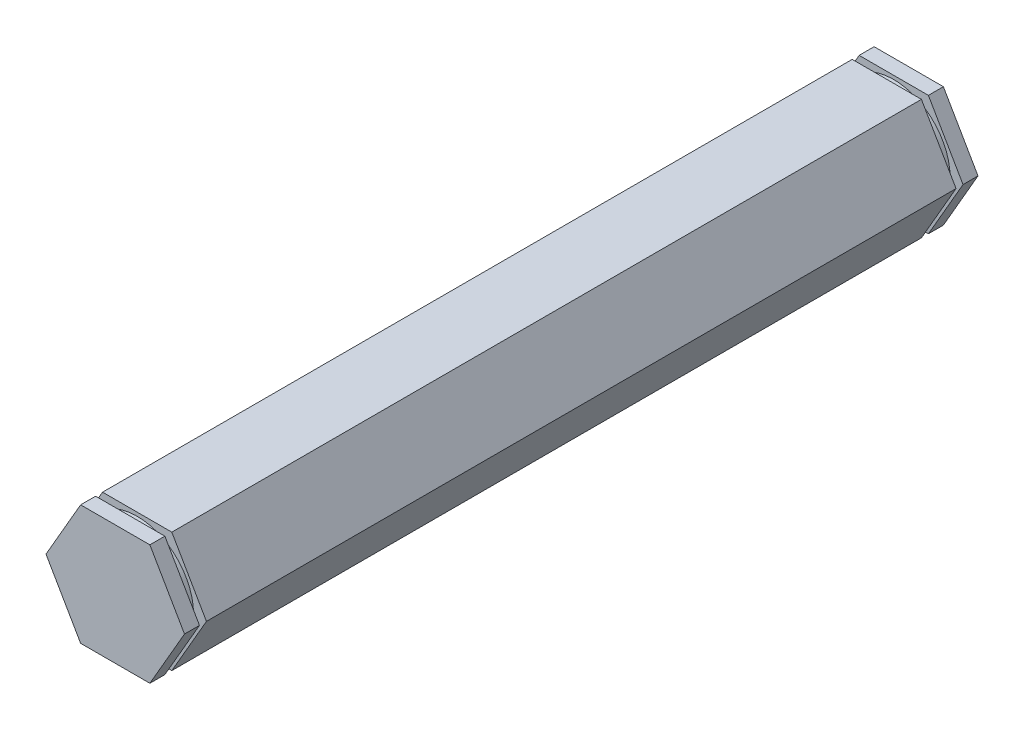
ISO-10303-21;
HEADER;
FILE_DESCRIPTION(('STEP AP214'),'2;1');
FILE_NAME('part.step','',(''),(''),'','','');
FILE_SCHEMA(('AUTOMOTIVE_DESIGN { 1 0 10303 214 1 1 1 1 }'));
ENDSEC;
DATA;
#1=APPLICATION_CONTEXT('core data for automotive mechanical design processes');
#2=APPLICATION_PROTOCOL_DEFINITION('international standard','automotive_design',2000,#1);
#3=PRODUCT_CONTEXT('',#1,'mechanical');
#4=PRODUCT('Part','Part','',(#3));
#5=PRODUCT_RELATED_PRODUCT_CATEGORY('part','',(#4));
#6=PRODUCT_DEFINITION_FORMATION('','',#4);
#7=PRODUCT_DEFINITION_CONTEXT('part definition',#1,'design');
#8=PRODUCT_DEFINITION('design','',#6,#7);
#9=PRODUCT_DEFINITION_SHAPE('','',#8);
#10=(LENGTH_UNIT() NAMED_UNIT(*) SI_UNIT(.MILLI.,.METRE.));
#11=(NAMED_UNIT(*) PLANE_ANGLE_UNIT() SI_UNIT($,.RADIAN.));
#12=(NAMED_UNIT(*) SI_UNIT($,.STERADIAN.) SOLID_ANGLE_UNIT());
#13=UNCERTAINTY_MEASURE_WITH_UNIT(LENGTH_MEASURE(1.E-05),#10,'distance_accuracy_value','');
#14=(GEOMETRIC_REPRESENTATION_CONTEXT(3) GLOBAL_UNCERTAINTY_ASSIGNED_CONTEXT((#13)) GLOBAL_UNIT_ASSIGNED_CONTEXT((#10,
#11,#12)) REPRESENTATION_CONTEXT('',''));
#15=CARTESIAN_POINT('',(0.,0.,0.));
#16=DIRECTION('',(0.,0.,1.));
#17=DIRECTION('',(1.,0.,0.));
#18=AXIS2_PLACEMENT_3D('',#15,#16,#17);
#19=CARTESIAN_POINT('',(3.66617420935418,-6.34999999999993,-52.2732));
#20=DIRECTION('',(0.866025403784441,-0.499999999999995,0.));
#21=DIRECTION('',(0.499999999999995,0.866025403784442,0.));
#22=AXIS2_PLACEMENT_3D('',#19,#20,#21);
#23=PLANE('',#22);
#24=DIRECTION('',(0.5,0.866025403784439,0.));
#25=VECTOR('',#24,1.);
#26=CARTESIAN_POINT('',(5.49926131403119,-3.175,-49.9491));
#27=LINE('',#26,#25);
#28=CARTESIAN_POINT('',(3.66617420935412,-6.35,-49.9491));
#29=VERTEX_POINT('',#28);
#30=CARTESIAN_POINT('',(7.33234841870825,0.,-49.9491));
#31=VERTEX_POINT('',#30);
#32=EDGE_CURVE('E244',#29,#31,#27,.T.);
#33=ORIENTED_EDGE('',*,*,#32,.T.);
#34=DIRECTION('',(0.,0.,1.));
#35=VECTOR('',#34,1.);
#36=CARTESIAN_POINT('',(7.33234841870822,0.,-52.2732));
#37=LINE('',#36,#35);
#38=CARTESIAN_POINT('',(7.33234841870822,0.,29.4259));
#39=VERTEX_POINT('',#38);
#40=EDGE_CURVE('E189',#31,#39,#37,.T.);
#41=ORIENTED_EDGE('',*,*,#40,.T.);
#42=DIRECTION('',(0.5,0.866025403784439,0.));
#43=VECTOR('',#42,1.);
#44=CARTESIAN_POINT('',(5.49926131403119,-3.175,29.4259));
#45=LINE('',#44,#43);
#46=CARTESIAN_POINT('',(3.66617420935412,-6.35,29.4259));
#47=VERTEX_POINT('',#46);
#48=EDGE_CURVE('E243',#47,#39,#45,.T.);
#49=ORIENTED_EDGE('',*,*,#48,.F.);
#50=DIRECTION('',(0.,0.,1.));
#51=VECTOR('',#50,1.);
#52=CARTESIAN_POINT('',(3.66617420935418,-6.34999999999993,-52.2732));
#53=LINE('',#52,#51);
#54=EDGE_CURVE('E46',#29,#47,#53,.T.);
#55=ORIENTED_EDGE('',*,*,#54,.F.);
#56=EDGE_LOOP('',(#33,#41,#49,#55));
#57=FACE_BOUND('',#56,.T.);
#58=ADVANCED_FACE('F37',(#57),#23,.T.);
#59=CARTESIAN_POINT('',(-3.66617420935405,-6.35000000000001,-52.2732));
#60=DIRECTION('',(0.,-1.,0.));
#61=DIRECTION('',(1.,0.,0.));
#62=AXIS2_PLACEMENT_3D('',#59,#60,#61);
#63=PLANE('',#62);
#64=DIRECTION('',(1.,0.,0.));
#65=VECTOR('',#64,1.);
#66=CARTESIAN_POINT('',(0.,-6.35,-49.9491));
#67=LINE('',#66,#65);
#68=CARTESIAN_POINT('',(-3.66617420935412,-6.35,-49.9491));
#69=VERTEX_POINT('',#68);
#70=EDGE_CURVE('E316',#69,#29,#67,.T.);
#71=ORIENTED_EDGE('',*,*,#70,.T.);
#72=ORIENTED_EDGE('',*,*,#54,.T.);
#73=DIRECTION('',(1.,0.,0.));
#74=VECTOR('',#73,1.);
#75=CARTESIAN_POINT('',(0.,-6.35,29.4259));
#76=LINE('',#75,#74);
#77=CARTESIAN_POINT('',(-3.66617420935412,-6.35,29.4259));
#78=VERTEX_POINT('',#77);
#79=EDGE_CURVE('E256',#78,#47,#76,.T.);
#80=ORIENTED_EDGE('',*,*,#79,.F.);
#81=DIRECTION('',(0.,0.,1.));
#82=VECTOR('',#81,1.);
#83=CARTESIAN_POINT('',(-3.66617420935405,-6.35000000000001,-52.2732));
#84=LINE('',#83,#82);
#85=EDGE_CURVE('E215',#69,#78,#84,.T.);
#86=ORIENTED_EDGE('',*,*,#85,.F.);
#87=EDGE_LOOP('',(#71,#72,#80,#86));
#88=FACE_BOUND('',#87,.T.);
#89=ADVANCED_FACE('F348',(#88),#63,.T.);
#90=CARTESIAN_POINT('',(-7.33234841870822,0.,-52.2732));
#91=DIRECTION('',(-0.866025403784434,-0.500000000000007,0.));
#92=DIRECTION('',(0.500000000000007,-0.866025403784435,0.));
#93=AXIS2_PLACEMENT_3D('',#90,#91,#92);
#94=PLANE('',#93);
#95=DIRECTION('',(0.5,-0.866025403784439,0.));
#96=VECTOR('',#95,1.);
#97=CARTESIAN_POINT('',(-5.49926131403118,-3.175,-49.9491));
#98=LINE('',#97,#96);
#99=CARTESIAN_POINT('',(-7.33234841870824,0.,-49.9491));
#100=VERTEX_POINT('',#99);
#101=EDGE_CURVE('E326',#100,#69,#98,.T.);
#102=ORIENTED_EDGE('',*,*,#101,.T.);
#103=ORIENTED_EDGE('',*,*,#85,.T.);
#104=DIRECTION('',(0.5,-0.866025403784439,0.));
#105=VECTOR('',#104,1.);
#106=CARTESIAN_POINT('',(-5.49926131403118,-3.175,29.4259));
#107=LINE('',#106,#105);
#108=CARTESIAN_POINT('',(-7.33234841870824,0.,29.4259));
#109=VERTEX_POINT('',#108);
#110=EDGE_CURVE('E198',#109,#78,#107,.T.);
#111=ORIENTED_EDGE('',*,*,#110,.F.);
#112=DIRECTION('',(0.,0.,1.));
#113=VECTOR('',#112,1.);
#114=CARTESIAN_POINT('',(-7.33234841870822,0.,-52.2732));
#115=LINE('',#114,#113);
#116=EDGE_CURVE('E220',#100,#109,#115,.T.);
#117=ORIENTED_EDGE('',*,*,#116,.F.);
#118=EDGE_LOOP('',(#102,#103,#111,#117));
#119=FACE_BOUND('',#118,.T.);
#120=ADVANCED_FACE('F352',(#119),#94,.T.);
#121=CARTESIAN_POINT('',(-3.66617420935414,6.34999999999996,-52.2732));
#122=DIRECTION('',(-0.866025403784441,0.499999999999995,0.));
#123=DIRECTION('',(-0.499999999999995,-0.866025403784442,0.));
#124=AXIS2_PLACEMENT_3D('',#121,#122,#123);
#125=PLANE('',#124);
#126=DIRECTION('',(-0.5,-0.866025403784439,0.));
#127=VECTOR('',#126,1.);
#128=CARTESIAN_POINT('',(-5.49926131403118,3.175,-49.9491));
#129=LINE('',#128,#127);
#130=CARTESIAN_POINT('',(-3.66617420935412,6.35,-49.9491));
#131=VERTEX_POINT('',#130);
#132=EDGE_CURVE('E323',#131,#100,#129,.T.);
#133=ORIENTED_EDGE('',*,*,#132,.T.);
#134=ORIENTED_EDGE('',*,*,#116,.T.);
#135=DIRECTION('',(-0.5,-0.866025403784439,0.));
#136=VECTOR('',#135,1.);
#137=CARTESIAN_POINT('',(-5.49926131403118,3.175,29.4259));
#138=LINE('',#137,#136);
#139=CARTESIAN_POINT('',(-3.66617420935412,6.35,29.4259));
#140=VERTEX_POINT('',#139);
#141=EDGE_CURVE('E262',#140,#109,#138,.T.);
#142=ORIENTED_EDGE('',*,*,#141,.F.);
#143=DIRECTION('',(0.,0.,1.));
#144=VECTOR('',#143,1.);
#145=CARTESIAN_POINT('',(-3.66617420935414,6.34999999999996,-52.2732));
#146=LINE('',#145,#144);
#147=EDGE_CURVE('E224',#131,#140,#146,.T.);
#148=ORIENTED_EDGE('',*,*,#147,.F.);
#149=EDGE_LOOP('',(#133,#134,#142,#148));
#150=FACE_BOUND('',#149,.T.);
#151=ADVANCED_FACE('F413',(#150),#125,.T.);
#152=CARTESIAN_POINT('',(3.6661742093541,6.34999999999998,-52.2732));
#153=DIRECTION('',(0.,1.,0.));
#154=DIRECTION('',(-1.,0.,0.));
#155=AXIS2_PLACEMENT_3D('',#152,#153,#154);
#156=PLANE('',#155);
#157=DIRECTION('',(-1.,0.,0.));
#158=VECTOR('',#157,1.);
#159=CARTESIAN_POINT('',(0.,6.35,-49.9491));
#160=LINE('',#159,#158);
#161=CARTESIAN_POINT('',(3.6661742093541,6.34999999999998,-49.9491));
#162=VERTEX_POINT('',#161);
#163=EDGE_CURVE('E63',#162,#131,#160,.T.);
#164=ORIENTED_EDGE('',*,*,#163,.T.);
#165=ORIENTED_EDGE('',*,*,#147,.T.);
#166=DIRECTION('',(-1.,0.,0.));
#167=VECTOR('',#166,1.);
#168=CARTESIAN_POINT('',(0.,6.35,29.4259));
#169=LINE('',#168,#167);
#170=CARTESIAN_POINT('',(3.66617420935412,6.35,29.4259));
#171=VERTEX_POINT('',#170);
#172=EDGE_CURVE('E260',#171,#140,#169,.T.);
#173=ORIENTED_EDGE('',*,*,#172,.F.);
#174=DIRECTION('',(0.,0.,1.));
#175=VECTOR('',#174,1.);
#176=CARTESIAN_POINT('',(3.6661742093541,6.34999999999998,-52.2732));
#177=LINE('',#176,#175);
#178=EDGE_CURVE('E228',#162,#171,#177,.T.);
#179=ORIENTED_EDGE('',*,*,#178,.F.);
#180=EDGE_LOOP('',(#164,#165,#173,#179));
#181=FACE_BOUND('',#180,.T.);
#182=ADVANCED_FACE('F407',(#181),#156,.T.);
#183=CARTESIAN_POINT('',(7.33234841870822,0.,-52.2732));
#184=DIRECTION('',(0.866025403784438,0.500000000000001,0.));
#185=DIRECTION('',(-0.500000000000001,0.866025403784438,0.));
#186=AXIS2_PLACEMENT_3D('',#183,#184,#185);
#187=PLANE('',#186);
#188=DIRECTION('',(-0.5,0.866025403784439,0.));
#189=VECTOR('',#188,1.);
#190=CARTESIAN_POINT('',(5.49926131403118,3.175,-49.9491));
#191=LINE('',#190,#189);
#192=EDGE_CURVE('E320',#31,#162,#191,.T.);
#193=ORIENTED_EDGE('',*,*,#192,.T.);
#194=ORIENTED_EDGE('',*,*,#178,.T.);
#195=DIRECTION('',(-0.5,0.866025403784439,0.));
#196=VECTOR('',#195,1.);
#197=CARTESIAN_POINT('',(5.49926131403118,3.175,29.4259));
#198=LINE('',#197,#196);
#199=EDGE_CURVE('E252',#39,#171,#198,.T.);
#200=ORIENTED_EDGE('',*,*,#199,.F.);
#201=ORIENTED_EDGE('',*,*,#40,.F.);
#202=EDGE_LOOP('',(#193,#194,#200,#201));
#203=FACE_BOUND('',#202,.T.);
#204=ADVANCED_FACE('F258',(#203),#187,.T.);
#205=CARTESIAN_POINT('',(0.,0.,29.4259));
#206=DIRECTION('',(0.,0.,1.));
#207=DIRECTION('',(1.,0.,0.));
#208=AXIS2_PLACEMENT_3D('',#205,#206,#207);
#209=CYLINDRICAL_SURFACE('',#208,5.969);
#210=CARTESIAN_POINT('',(0.,0.,29.4259));
#211=DIRECTION('',(0.,0.,1.));
#212=DIRECTION('',(1.,0.,0.));
#213=AXIS2_PLACEMENT_3D('',#210,#211,#212);
#214=CIRCLE('',#213,5.969);
#215=CARTESIAN_POINT('',(5.969,0.,29.4259));
#216=VERTEX_POINT('',#215);
#217=EDGE_CURVE('E289',#216,#216,#214,.T.);
#218=ORIENTED_EDGE('',*,*,#217,.T.);
#219=EDGE_LOOP('',(#218));
#220=FACE_BOUND('',#219,.T.);
#221=CARTESIAN_POINT('',(0.,0.,30.1625));
#222=DIRECTION('',(0.,0.,1.));
#223=DIRECTION('',(1.,0.,0.));
#224=AXIS2_PLACEMENT_3D('',#221,#222,#223);
#225=CIRCLE('',#224,5.969);
#226=CARTESIAN_POINT('',(5.969,0.,30.1625));
#227=VERTEX_POINT('',#226);
#228=EDGE_CURVE('E269',#227,#227,#225,.T.);
#229=ORIENTED_EDGE('',*,*,#228,.F.);
#230=EDGE_LOOP('',(#229));
#231=FACE_BOUND('',#230,.T.);
#232=ADVANCED_FACE('F332',(#220,#231),#209,.T.);
#233=CARTESIAN_POINT('',(0.,0.,29.4259));
#234=DIRECTION('',(0.,0.,1.));
#235=DIRECTION('',(1.,0.,0.));
#236=AXIS2_PLACEMENT_3D('',#233,#234,#235);
#237=PLANE('',#236);
#238=ORIENTED_EDGE('',*,*,#217,.F.);
#239=EDGE_LOOP('',(#238));
#240=FACE_BOUND('',#239,.T.);
#241=ORIENTED_EDGE('',*,*,#79,.T.);
#242=ORIENTED_EDGE('',*,*,#48,.T.);
#243=ORIENTED_EDGE('',*,*,#199,.T.);
#244=ORIENTED_EDGE('',*,*,#172,.T.);
#245=ORIENTED_EDGE('',*,*,#141,.T.);
#246=ORIENTED_EDGE('',*,*,#110,.T.);
#247=EDGE_LOOP('',(#241,#242,#243,#244,#245,#246));
#248=FACE_BOUND('',#247,.T.);
#249=ADVANCED_FACE('F250',(#240,#248),#237,.T.);
#250=CARTESIAN_POINT('',(0.,0.,30.1625));
#251=DIRECTION('',(0.,0.,1.));
#252=DIRECTION('',(1.,0.,0.));
#253=AXIS2_PLACEMENT_3D('',#250,#251,#252);
#254=PLANE('',#253);
#255=ORIENTED_EDGE('',*,*,#228,.T.);
#256=EDGE_LOOP('',(#255));
#257=FACE_BOUND('',#256,.T.);
#258=DIRECTION('',(1.,0.,0.));
#259=VECTOR('',#258,1.);
#260=CARTESIAN_POINT('',(0.,-6.35,30.1625));
#261=LINE('',#260,#259);
#262=CARTESIAN_POINT('',(-3.66617420935412,-6.35,30.1625));
#263=VERTEX_POINT('',#262);
#264=CARTESIAN_POINT('',(3.66617420935412,-6.35,30.1625));
#265=VERTEX_POINT('',#264);
#266=EDGE_CURVE('E272',#263,#265,#261,.T.);
#267=ORIENTED_EDGE('',*,*,#266,.F.);
#268=DIRECTION('',(0.5,-0.866025403784439,0.));
#269=VECTOR('',#268,1.);
#270=CARTESIAN_POINT('',(-5.49926131403118,-3.175,30.1625));
#271=LINE('',#270,#269);
#272=CARTESIAN_POINT('',(-7.33234841870824,0.,30.1625));
#273=VERTEX_POINT('',#272);
#274=EDGE_CURVE('E286',#273,#263,#271,.T.);
#275=ORIENTED_EDGE('',*,*,#274,.F.);
#276=DIRECTION('',(-0.5,-0.866025403784439,0.));
#277=VECTOR('',#276,1.);
#278=CARTESIAN_POINT('',(-5.49926131403118,3.175,30.1625));
#279=LINE('',#278,#277);
#280=CARTESIAN_POINT('',(-3.66617420935412,6.35,30.1625));
#281=VERTEX_POINT('',#280);
#282=EDGE_CURVE('E283',#281,#273,#279,.T.);
#283=ORIENTED_EDGE('',*,*,#282,.F.);
#284=DIRECTION('',(-1.,0.,0.));
#285=VECTOR('',#284,1.);
#286=CARTESIAN_POINT('',(0.,6.35,30.1625));
#287=LINE('',#286,#285);
#288=CARTESIAN_POINT('',(3.6661742093541,6.34999999999998,30.1625));
#289=VERTEX_POINT('',#288);
#290=EDGE_CURVE('E280',#289,#281,#287,.T.);
#291=ORIENTED_EDGE('',*,*,#290,.F.);
#292=DIRECTION('',(-0.5,0.866025403784439,0.));
#293=VECTOR('',#292,1.);
#294=CARTESIAN_POINT('',(5.49926131403118,3.175,30.1625));
#295=LINE('',#294,#293);
#296=CARTESIAN_POINT('',(7.33234841870825,0.,30.1625));
#297=VERTEX_POINT('',#296);
#298=EDGE_CURVE('E278',#297,#289,#295,.T.);
#299=ORIENTED_EDGE('',*,*,#298,.F.);
#300=DIRECTION('',(0.5,0.866025403784439,0.));
#301=VECTOR('',#300,1.);
#302=CARTESIAN_POINT('',(5.49926131403119,-3.175,30.1625));
#303=LINE('',#302,#301);
#304=EDGE_CURVE('E275',#265,#297,#303,.T.);
#305=ORIENTED_EDGE('',*,*,#304,.F.);
#306=EDGE_LOOP('',(#267,#275,#283,#291,#299,#305));
#307=FACE_BOUND('',#306,.T.);
#308=ADVANCED_FACE('F336',(#257,#307),#254,.F.);
#309=CARTESIAN_POINT('',(0.,0.,31.75));
#310=DIRECTION('',(0.,0.,1.));
#311=DIRECTION('',(1.,0.,0.));
#312=AXIS2_PLACEMENT_3D('',#309,#310,#311);
#313=PLANE('',#312);
#314=DIRECTION('',(0.499999999999995,0.866025403784441,0.));
#315=VECTOR('',#314,1.);
#316=CARTESIAN_POINT('',(3.66617420935418,-6.34999999999993,31.75));
#317=LINE('',#316,#315);
#318=CARTESIAN_POINT('',(3.66617420935418,-6.34999999999993,31.75));
#319=VERTEX_POINT('',#318);
#320=CARTESIAN_POINT('',(7.33234841870822,0.,31.75));
#321=VERTEX_POINT('',#320);
#322=EDGE_CURVE('E194',#319,#321,#317,.T.);
#323=ORIENTED_EDGE('',*,*,#322,.T.);
#324=DIRECTION('',(-0.500000000000001,0.866025403784438,0.));
#325=VECTOR('',#324,1.);
#326=CARTESIAN_POINT('',(7.33234841870822,0.,31.75));
#327=LINE('',#326,#325);
#328=CARTESIAN_POINT('',(3.6661742093541,6.34999999999998,31.75));
#329=VERTEX_POINT('',#328);
#330=EDGE_CURVE('E197',#321,#329,#327,.T.);
#331=ORIENTED_EDGE('',*,*,#330,.T.);
#332=DIRECTION('',(-1.,0.,0.));
#333=VECTOR('',#332,1.);
#334=CARTESIAN_POINT('',(3.6661742093541,6.34999999999998,31.75));
#335=LINE('',#334,#333);
#336=CARTESIAN_POINT('',(-3.66617420935414,6.34999999999996,31.75));
#337=VERTEX_POINT('',#336);
#338=EDGE_CURVE('E201',#329,#337,#335,.T.);
#339=ORIENTED_EDGE('',*,*,#338,.T.);
#340=DIRECTION('',(-0.499999999999995,-0.866025403784441,0.));
#341=VECTOR('',#340,1.);
#342=CARTESIAN_POINT('',(-3.66617420935414,6.34999999999996,31.75));
#343=LINE('',#342,#341);
#344=CARTESIAN_POINT('',(-7.33234841870822,0.,31.75));
#345=VERTEX_POINT('',#344);
#346=EDGE_CURVE('E204',#337,#345,#343,.T.);
#347=ORIENTED_EDGE('',*,*,#346,.T.);
#348=DIRECTION('',(0.500000000000007,-0.866025403784434,0.));
#349=VECTOR('',#348,1.);
#350=CARTESIAN_POINT('',(-7.33234841870822,0.,31.75));
#351=LINE('',#350,#349);
#352=CARTESIAN_POINT('',(-3.66617420935405,-6.35000000000001,31.75));
#353=VERTEX_POINT('',#352);
#354=EDGE_CURVE('E207',#345,#353,#351,.T.);
#355=ORIENTED_EDGE('',*,*,#354,.T.);
#356=DIRECTION('',(1.,0.,0.));
#357=VECTOR('',#356,1.);
#358=CARTESIAN_POINT('',(-3.66617420935405,-6.35000000000001,31.75));
#359=LINE('',#358,#357);
#360=EDGE_CURVE('E210',#353,#319,#359,.T.);
#361=ORIENTED_EDGE('',*,*,#360,.T.);
#362=EDGE_LOOP('',(#323,#331,#339,#347,#355,#361));
#363=FACE_BOUND('',#362,.T.);
#364=ADVANCED_FACE('F342',(#363),#313,.T.);
#365=ORIENTED_EDGE('',*,*,#298,.T.);
#366=EDGE_CURVE('E229',#289,#329,#177,.T.);
#367=ORIENTED_EDGE('',*,*,#366,.T.);
#368=ORIENTED_EDGE('',*,*,#330,.F.);
#369=EDGE_CURVE('E186',#297,#321,#37,.T.);
#370=ORIENTED_EDGE('',*,*,#369,.F.);
#371=EDGE_LOOP('',(#365,#367,#368,#370));
#372=FACE_BOUND('',#371,.T.);
#373=ADVANCED_FACE('F399',(#372),#187,.T.);
#374=ORIENTED_EDGE('',*,*,#290,.T.);
#375=EDGE_CURVE('E225',#281,#337,#146,.T.);
#376=ORIENTED_EDGE('',*,*,#375,.T.);
#377=ORIENTED_EDGE('',*,*,#338,.F.);
#378=ORIENTED_EDGE('',*,*,#366,.F.);
#379=EDGE_LOOP('',(#374,#376,#377,#378));
#380=FACE_BOUND('',#379,.T.);
#381=ADVANCED_FACE('F398',(#380),#156,.T.);
#382=ORIENTED_EDGE('',*,*,#282,.T.);
#383=EDGE_CURVE('E221',#273,#345,#115,.T.);
#384=ORIENTED_EDGE('',*,*,#383,.T.);
#385=ORIENTED_EDGE('',*,*,#346,.F.);
#386=ORIENTED_EDGE('',*,*,#375,.F.);
#387=EDGE_LOOP('',(#382,#384,#385,#386));
#388=FACE_BOUND('',#387,.T.);
#389=ADVANCED_FACE('F376',(#388),#125,.T.);
#390=ORIENTED_EDGE('',*,*,#274,.T.);
#391=EDGE_CURVE('E216',#263,#353,#84,.T.);
#392=ORIENTED_EDGE('',*,*,#391,.T.);
#393=ORIENTED_EDGE('',*,*,#354,.F.);
#394=ORIENTED_EDGE('',*,*,#383,.F.);
#395=EDGE_LOOP('',(#390,#392,#393,#394));
#396=FACE_BOUND('',#395,.T.);
#397=ADVANCED_FACE('F369',(#396),#94,.T.);
#398=ORIENTED_EDGE('',*,*,#266,.T.);
#399=EDGE_CURVE('E48',#265,#319,#53,.T.);
#400=ORIENTED_EDGE('',*,*,#399,.T.);
#401=ORIENTED_EDGE('',*,*,#360,.F.);
#402=ORIENTED_EDGE('',*,*,#391,.F.);
#403=EDGE_LOOP('',(#398,#400,#401,#402));
#404=FACE_BOUND('',#403,.T.);
#405=ADVANCED_FACE('F355',(#404),#63,.T.);
#406=ORIENTED_EDGE('',*,*,#304,.T.);
#407=ORIENTED_EDGE('',*,*,#369,.T.);
#408=ORIENTED_EDGE('',*,*,#322,.F.);
#409=ORIENTED_EDGE('',*,*,#399,.F.);
#410=EDGE_LOOP('',(#406,#407,#408,#409));
#411=FACE_BOUND('',#410,.T.);
#412=ADVANCED_FACE('F39',(#411),#23,.T.);
#413=CARTESIAN_POINT('',(0.,0.,-50.6857));
#414=DIRECTION('',(0.,0.,1.));
#415=DIRECTION('',(1.,0.,0.));
#416=AXIS2_PLACEMENT_3D('',#413,#414,#415);
#417=CYLINDRICAL_SURFACE('',#416,5.969);
#418=CARTESIAN_POINT('',(0.,0.,-50.6857));
#419=DIRECTION('',(0.,0.,1.));
#420=DIRECTION('',(1.,0.,0.));
#421=AXIS2_PLACEMENT_3D('',#418,#419,#420);
#422=CIRCLE('',#421,5.969);
#423=CARTESIAN_POINT('',(5.969,0.,-50.6857));
#424=VERTEX_POINT('',#423);
#425=EDGE_CURVE('E169',#424,#424,#422,.T.);
#426=ORIENTED_EDGE('',*,*,#425,.T.);
#427=EDGE_LOOP('',(#426));
#428=FACE_BOUND('',#427,.T.);
#429=CARTESIAN_POINT('',(0.,0.,-49.9491));
#430=DIRECTION('',(0.,0.,1.));
#431=DIRECTION('',(1.,0.,0.));
#432=AXIS2_PLACEMENT_3D('',#429,#430,#431);
#433=CIRCLE('',#432,5.969);
#434=CARTESIAN_POINT('',(5.969,0.,-49.9491));
#435=VERTEX_POINT('',#434);
#436=EDGE_CURVE('E313',#435,#435,#433,.T.);
#437=ORIENTED_EDGE('',*,*,#436,.F.);
#438=EDGE_LOOP('',(#437));
#439=FACE_BOUND('',#438,.T.);
#440=ADVANCED_FACE('F357',(#428,#439),#417,.T.);
#441=CARTESIAN_POINT('',(0.,0.,-50.6857));
#442=DIRECTION('',(0.,0.,1.));
#443=DIRECTION('',(1.,0.,0.));
#444=AXIS2_PLACEMENT_3D('',#441,#442,#443);
#445=PLANE('',#444);
#446=ORIENTED_EDGE('',*,*,#425,.F.);
#447=EDGE_LOOP('',(#446));
#448=FACE_BOUND('',#447,.T.);
#449=DIRECTION('',(1.,0.,0.));
#450=VECTOR('',#449,1.);
#451=CARTESIAN_POINT('',(0.,-6.35,-50.6857));
#452=LINE('',#451,#450);
#453=CARTESIAN_POINT('',(-3.66617420935412,-6.35,-50.6857));
#454=VERTEX_POINT('',#453);
#455=CARTESIAN_POINT('',(3.66617420935412,-6.35,-50.6857));
#456=VERTEX_POINT('',#455);
#457=EDGE_CURVE('E163',#454,#456,#452,.T.);
#458=ORIENTED_EDGE('',*,*,#457,.T.);
#459=DIRECTION('',(0.5,0.866025403784439,0.));
#460=VECTOR('',#459,1.);
#461=CARTESIAN_POINT('',(5.49926131403119,-3.175,-50.6857));
#462=LINE('',#461,#460);
#463=CARTESIAN_POINT('',(7.33234841870822,0.,-50.6857));
#464=VERTEX_POINT('',#463);
#465=EDGE_CURVE('E55',#456,#464,#462,.T.);
#466=ORIENTED_EDGE('',*,*,#465,.T.);
#467=DIRECTION('',(-0.5,0.866025403784439,0.));
#468=VECTOR('',#467,1.);
#469=CARTESIAN_POINT('',(5.49926131403118,3.175,-50.6857));
#470=LINE('',#469,#468);
#471=CARTESIAN_POINT('',(3.66617420935412,6.35,-50.6857));
#472=VERTEX_POINT('',#471);
#473=EDGE_CURVE('E176',#464,#472,#470,.T.);
#474=ORIENTED_EDGE('',*,*,#473,.T.);
#475=DIRECTION('',(-1.,0.,0.));
#476=VECTOR('',#475,1.);
#477=CARTESIAN_POINT('',(0.,6.35,-50.6857));
#478=LINE('',#477,#476);
#479=CARTESIAN_POINT('',(-3.66617420935412,6.35,-50.6857));
#480=VERTEX_POINT('',#479);
#481=EDGE_CURVE('E306',#472,#480,#478,.T.);
#482=ORIENTED_EDGE('',*,*,#481,.T.);
#483=DIRECTION('',(-0.5,-0.866025403784439,0.));
#484=VECTOR('',#483,1.);
#485=CARTESIAN_POINT('',(-5.49926131403118,3.175,-50.6857));
#486=LINE('',#485,#484);
#487=CARTESIAN_POINT('',(-7.33234841870824,0.,-50.6857));
#488=VERTEX_POINT('',#487);
#489=EDGE_CURVE('E307',#480,#488,#486,.T.);
#490=ORIENTED_EDGE('',*,*,#489,.T.);
#491=DIRECTION('',(0.5,-0.866025403784439,0.));
#492=VECTOR('',#491,1.);
#493=CARTESIAN_POINT('',(-5.49926131403118,-3.175,-50.6857));
#494=LINE('',#493,#492);
#495=EDGE_CURVE('E166',#488,#454,#494,.T.);
#496=ORIENTED_EDGE('',*,*,#495,.T.);
#497=EDGE_LOOP('',(#458,#466,#474,#482,#490,#496));
#498=FACE_BOUND('',#497,.T.);
#499=ADVANCED_FACE('F164',(#448,#498),#445,.T.);
#500=CARTESIAN_POINT('',(0.,0.,-49.9491));
#501=DIRECTION('',(0.,0.,1.));
#502=DIRECTION('',(1.,0.,0.));
#503=AXIS2_PLACEMENT_3D('',#500,#501,#502);
#504=PLANE('',#503);
#505=ORIENTED_EDGE('',*,*,#436,.T.);
#506=EDGE_LOOP('',(#505));
#507=FACE_BOUND('',#506,.T.);
#508=ORIENTED_EDGE('',*,*,#70,.F.);
#509=ORIENTED_EDGE('',*,*,#101,.F.);
#510=ORIENTED_EDGE('',*,*,#132,.F.);
#511=ORIENTED_EDGE('',*,*,#163,.F.);
#512=ORIENTED_EDGE('',*,*,#192,.F.);
#513=ORIENTED_EDGE('',*,*,#32,.F.);
#514=EDGE_LOOP('',(#508,#509,#510,#511,#512,#513));
#515=FACE_BOUND('',#514,.T.);
#516=ADVANCED_FACE('F385',(#507,#515),#504,.F.);
#517=CARTESIAN_POINT('',(0.,0.,-52.2732));
#518=DIRECTION('',(0.,0.,1.));
#519=DIRECTION('',(1.,0.,0.));
#520=AXIS2_PLACEMENT_3D('',#517,#518,#519);
#521=PLANE('',#520);
#522=DIRECTION('',(0.499999999999995,0.866025403784441,0.));
#523=VECTOR('',#522,1.);
#524=CARTESIAN_POINT('',(3.66617420935418,-6.34999999999993,-52.2732));
#525=LINE('',#524,#523);
#526=CARTESIAN_POINT('',(3.66617420935418,-6.34999999999993,-52.2732));
#527=VERTEX_POINT('',#526);
#528=CARTESIAN_POINT('',(7.33234841870822,0.,-52.2732));
#529=VERTEX_POINT('',#528);
#530=EDGE_CURVE('E212',#527,#529,#525,.T.);
#531=ORIENTED_EDGE('',*,*,#530,.F.);
#532=DIRECTION('',(1.,0.,0.));
#533=VECTOR('',#532,1.);
#534=CARTESIAN_POINT('',(-3.66617420935405,-6.35000000000001,-52.2732));
#535=LINE('',#534,#533);
#536=CARTESIAN_POINT('',(-3.66617420935405,-6.35000000000001,-52.2732));
#537=VERTEX_POINT('',#536);
#538=EDGE_CURVE('E181',#537,#527,#535,.T.);
#539=ORIENTED_EDGE('',*,*,#538,.F.);
#540=DIRECTION('',(0.500000000000007,-0.866025403784434,0.));
#541=VECTOR('',#540,1.);
#542=CARTESIAN_POINT('',(-7.33234841870822,0.,-52.2732));
#543=LINE('',#542,#541);
#544=CARTESIAN_POINT('',(-7.33234841870822,0.,-52.2732));
#545=VERTEX_POINT('',#544);
#546=EDGE_CURVE('E187',#545,#537,#543,.T.);
#547=ORIENTED_EDGE('',*,*,#546,.F.);
#548=DIRECTION('',(-0.499999999999995,-0.866025403784441,0.));
#549=VECTOR('',#548,1.);
#550=CARTESIAN_POINT('',(-3.66617420935414,6.34999999999996,-52.2732));
#551=LINE('',#550,#549);
#552=CARTESIAN_POINT('',(-3.66617420935414,6.34999999999996,-52.2732));
#553=VERTEX_POINT('',#552);
#554=EDGE_CURVE('E190',#553,#545,#551,.T.);
#555=ORIENTED_EDGE('',*,*,#554,.F.);
#556=DIRECTION('',(-1.,0.,0.));
#557=VECTOR('',#556,1.);
#558=CARTESIAN_POINT('',(3.6661742093541,6.34999999999998,-52.2732));
#559=LINE('',#558,#557);
#560=CARTESIAN_POINT('',(3.6661742093541,6.34999999999998,-52.2732));
#561=VERTEX_POINT('',#560);
#562=EDGE_CURVE('E293',#561,#553,#559,.T.);
#563=ORIENTED_EDGE('',*,*,#562,.F.);
#564=DIRECTION('',(-0.500000000000001,0.866025403784438,0.));
#565=VECTOR('',#564,1.);
#566=CARTESIAN_POINT('',(7.33234841870822,0.,-52.2732));
#567=LINE('',#566,#565);
#568=EDGE_CURVE('E291',#529,#561,#567,.T.);
#569=ORIENTED_EDGE('',*,*,#568,.F.);
#570=EDGE_LOOP('',(#531,#539,#547,#555,#563,#569));
#571=FACE_BOUND('',#570,.T.);
#572=ADVANCED_FACE('F301',(#571),#521,.F.);
#573=EDGE_CURVE('E226',#561,#472,#177,.T.);
#574=ORIENTED_EDGE('',*,*,#573,.T.);
#575=ORIENTED_EDGE('',*,*,#473,.F.);
#576=EDGE_CURVE('E41',#529,#464,#37,.T.);
#577=ORIENTED_EDGE('',*,*,#576,.F.);
#578=ORIENTED_EDGE('',*,*,#568,.T.);
#579=EDGE_LOOP('',(#574,#575,#577,#578));
#580=FACE_BOUND('',#579,.T.);
#581=ADVANCED_FACE('F401',(#580),#187,.T.);
#582=EDGE_CURVE('E222',#553,#480,#146,.T.);
#583=ORIENTED_EDGE('',*,*,#582,.T.);
#584=ORIENTED_EDGE('',*,*,#481,.F.);
#585=ORIENTED_EDGE('',*,*,#573,.F.);
#586=ORIENTED_EDGE('',*,*,#562,.T.);
#587=EDGE_LOOP('',(#583,#584,#585,#586));
#588=FACE_BOUND('',#587,.T.);
#589=ADVANCED_FACE('F304',(#588),#156,.T.);
#590=EDGE_CURVE('E217',#545,#488,#115,.T.);
#591=ORIENTED_EDGE('',*,*,#590,.T.);
#592=ORIENTED_EDGE('',*,*,#489,.F.);
#593=ORIENTED_EDGE('',*,*,#582,.F.);
#594=ORIENTED_EDGE('',*,*,#554,.T.);
#595=EDGE_LOOP('',(#591,#592,#593,#594));
#596=FACE_BOUND('',#595,.T.);
#597=ADVANCED_FACE('F298',(#596),#125,.T.);
#598=EDGE_CURVE('E182',#537,#454,#84,.T.);
#599=ORIENTED_EDGE('',*,*,#598,.T.);
#600=ORIENTED_EDGE('',*,*,#495,.F.);
#601=ORIENTED_EDGE('',*,*,#590,.F.);
#602=ORIENTED_EDGE('',*,*,#546,.T.);
#603=EDGE_LOOP('',(#599,#600,#601,#602));
#604=FACE_BOUND('',#603,.T.);
#605=ADVANCED_FACE('F363',(#604),#94,.T.);
#606=EDGE_CURVE('E11',#527,#456,#53,.T.);
#607=ORIENTED_EDGE('',*,*,#606,.T.);
#608=ORIENTED_EDGE('',*,*,#457,.F.);
#609=ORIENTED_EDGE('',*,*,#598,.F.);
#610=ORIENTED_EDGE('',*,*,#538,.T.);
#611=EDGE_LOOP('',(#607,#608,#609,#610));
#612=FACE_BOUND('',#611,.T.);
#613=ADVANCED_FACE('F179',(#612),#63,.T.);
#614=ORIENTED_EDGE('',*,*,#576,.T.);
#615=ORIENTED_EDGE('',*,*,#465,.F.);
#616=ORIENTED_EDGE('',*,*,#606,.F.);
#617=ORIENTED_EDGE('',*,*,#530,.T.);
#618=EDGE_LOOP('',(#614,#615,#616,#617));
#619=FACE_BOUND('',#618,.T.);
#620=ADVANCED_FACE('F173',(#619),#23,.T.);
#621=CLOSED_SHELL('',(#58,#89,#120,#151,#182,#204,#232,#249,#308,#364,#373,#381,#389,#397,#405,
#412,#440,#499,#516,#572,#581,#589,#597,#605,#613,#620));
#622=MANIFOLD_SOLID_BREP('B2',#621);
#623=ADVANCED_BREP_SHAPE_REPRESENTATION('',(#18,#622),#14);
#624=SHAPE_DEFINITION_REPRESENTATION(#9,#623);
ENDSEC;
END-ISO-10303-21;
